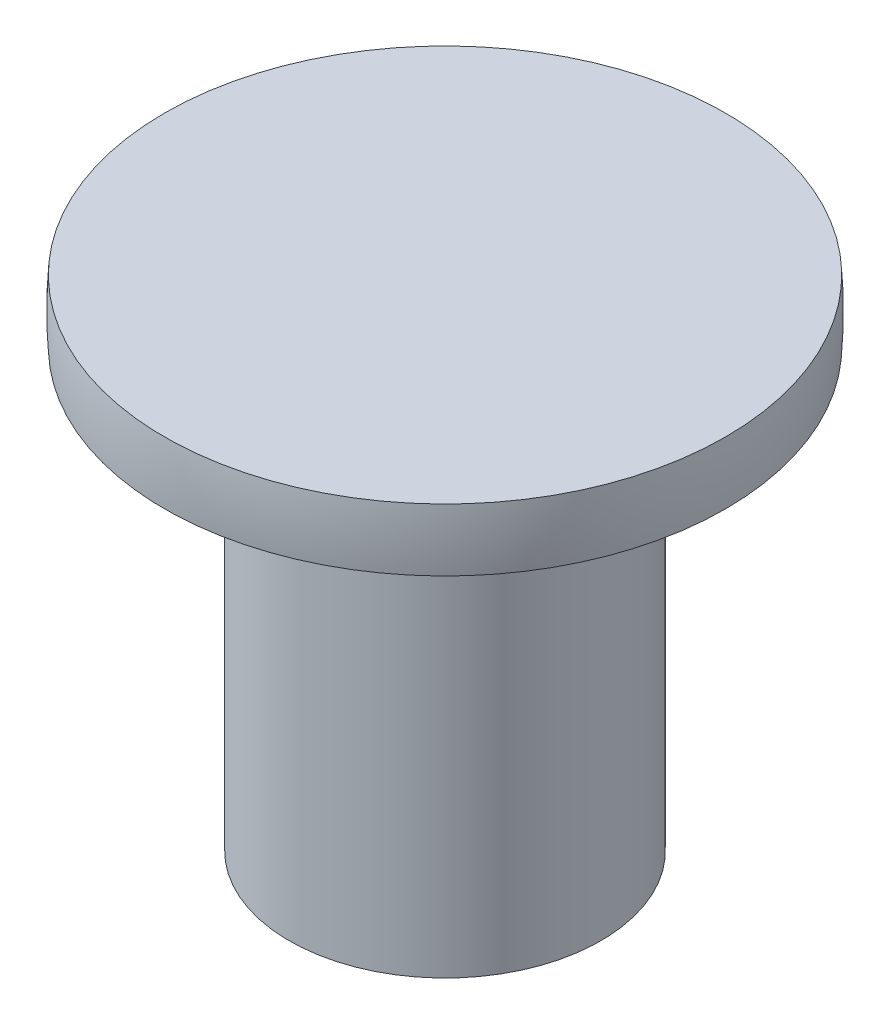
ISO-10303-21;
HEADER;
FILE_DESCRIPTION(('STEP AP214'),'2;1');
FILE_NAME('part.step','',(''),(''),'','','');
FILE_SCHEMA(('AUTOMOTIVE_DESIGN { 1 0 10303 214 1 1 1 1 }'));
ENDSEC;
DATA;
#1=APPLICATION_CONTEXT('core data for automotive mechanical design processes');
#2=APPLICATION_PROTOCOL_DEFINITION('international standard','automotive_design',2000,#1);
#3=PRODUCT_CONTEXT('',#1,'mechanical');
#4=PRODUCT('Part','Part','',(#3));
#5=PRODUCT_RELATED_PRODUCT_CATEGORY('part','',(#4));
#6=PRODUCT_DEFINITION_FORMATION('','',#4);
#7=PRODUCT_DEFINITION_CONTEXT('part definition',#1,'design');
#8=PRODUCT_DEFINITION('design','',#6,#7);
#9=PRODUCT_DEFINITION_SHAPE('','',#8);
#10=(LENGTH_UNIT() NAMED_UNIT(*) SI_UNIT(.MILLI.,.METRE.));
#11=(NAMED_UNIT(*) PLANE_ANGLE_UNIT() SI_UNIT($,.RADIAN.));
#12=(NAMED_UNIT(*) SI_UNIT($,.STERADIAN.) SOLID_ANGLE_UNIT());
#13=UNCERTAINTY_MEASURE_WITH_UNIT(LENGTH_MEASURE(1.E-05),#10,'distance_accuracy_value','');
#14=(GEOMETRIC_REPRESENTATION_CONTEXT(3) GLOBAL_UNCERTAINTY_ASSIGNED_CONTEXT((#13)) GLOBAL_UNIT_ASSIGNED_CONTEXT((#10,
#11,#12)) REPRESENTATION_CONTEXT('',''));
#15=CARTESIAN_POINT('',(0.,0.,0.));
#16=DIRECTION('',(0.,0.,1.));
#17=DIRECTION('',(1.,0.,0.));
#18=AXIS2_PLACEMENT_3D('',#15,#16,#17);
#19=CARTESIAN_POINT('',(4.5,8.,0.));
#20=DIRECTION('',(0.,-1.,0.));
#21=DIRECTION('',(1.,0.,0.));
#22=AXIS2_PLACEMENT_3D('',#19,#20,#21);
#23=PLANE('',#22);
#24=CARTESIAN_POINT('',(0.,8.,0.));
#25=DIRECTION('',(0.,1.,0.));
#26=DIRECTION('',(-1.,0.,0.));
#27=AXIS2_PLACEMENT_3D('',#24,#25,#26);
#28=CIRCLE('',#27,4.5);
#29=CARTESIAN_POINT('',(-4.5,8.,0.));
#30=VERTEX_POINT('',#29);
#31=EDGE_CURVE('E59',#30,#30,#28,.T.);
#32=ORIENTED_EDGE('',*,*,#31,.T.);
#33=EDGE_LOOP('',(#32));
#34=FACE_BOUND('',#33,.T.);
#35=ADVANCED_FACE('F37',(#34),#23,.F.);
#36=CARTESIAN_POINT('',(0.,4.5,0.));
#37=DIRECTION('',(0.,1.,0.));
#38=DIRECTION('',(-1.,0.,0.));
#39=AXIS2_PLACEMENT_3D('',#36,#37,#38);
#40=PLANE('',#39);
#41=CARTESIAN_POINT('',(0.,4.5,0.));
#42=DIRECTION('',(0.,1.,0.));
#43=DIRECTION('',(-1.,0.,0.));
#44=AXIS2_PLACEMENT_3D('',#41,#42,#43);
#45=CIRCLE('',#44,1.8);
#46=CARTESIAN_POINT('',(-1.8,4.5,0.));
#47=VERTEX_POINT('',#46);
#48=EDGE_CURVE('E10',#47,#47,#45,.T.);
#49=ORIENTED_EDGE('',*,*,#48,.F.);
#50=EDGE_LOOP('',(#49));
#51=FACE_BOUND('',#50,.T.);
#52=ADVANCED_FACE('F89',(#51),#40,.F.);
#53=CARTESIAN_POINT('',(0.,8.,0.));
#54=DIRECTION('',(0.,1.,0.));
#55=DIRECTION('',(-1.,0.,0.));
#56=AXIS2_PLACEMENT_3D('',#53,#54,#55);
#57=CYLINDRICAL_SURFACE('',#56,1.8);
#58=CARTESIAN_POINT('',(0.,0.,0.));
#59=DIRECTION('',(0.,1.,0.));
#60=DIRECTION('',(-1.,0.,0.));
#61=AXIS2_PLACEMENT_3D('',#58,#59,#60);
#62=CIRCLE('',#61,1.8);
#63=CARTESIAN_POINT('',(-1.8,0.,0.));
#64=VERTEX_POINT('',#63);
#65=EDGE_CURVE('E43',#64,#64,#62,.T.);
#66=ORIENTED_EDGE('',*,*,#65,.F.);
#67=EDGE_LOOP('',(#66));
#68=FACE_BOUND('',#67,.T.);
#69=ORIENTED_EDGE('',*,*,#48,.T.);
#70=EDGE_LOOP('',(#69));
#71=FACE_BOUND('',#70,.T.);
#72=ADVANCED_FACE('F84',(#68,#71),#57,.F.);
#73=CARTESIAN_POINT('',(1.8,0.,0.));
#74=DIRECTION('',(0.,1.,0.));
#75=DIRECTION('',(-1.,0.,0.));
#76=AXIS2_PLACEMENT_3D('',#73,#74,#75);
#77=PLANE('',#76);
#78=CARTESIAN_POINT('',(0.,0.,0.));
#79=DIRECTION('',(0.,1.,0.));
#80=DIRECTION('',(-1.,0.,0.));
#81=AXIS2_PLACEMENT_3D('',#78,#79,#80);
#82=CIRCLE('',#81,2.5);
#83=CARTESIAN_POINT('',(-2.5,0.,0.));
#84=VERTEX_POINT('',#83);
#85=EDGE_CURVE('E47',#84,#84,#82,.T.);
#86=ORIENTED_EDGE('',*,*,#85,.F.);
#87=EDGE_LOOP('',(#86));
#88=FACE_BOUND('',#87,.T.);
#89=ORIENTED_EDGE('',*,*,#65,.T.);
#90=EDGE_LOOP('',(#89));
#91=FACE_BOUND('',#90,.T.);
#92=ADVANCED_FACE('F79',(#88,#91),#77,.F.);
#93=CARTESIAN_POINT('',(0.,8.,0.));
#94=DIRECTION('',(0.,1.,0.));
#95=DIRECTION('',(-1.,0.,0.));
#96=AXIS2_PLACEMENT_3D('',#93,#94,#95);
#97=CYLINDRICAL_SURFACE('',#96,2.5);
#98=CARTESIAN_POINT('',(0.,7.,0.));
#99=DIRECTION('',(0.,1.,0.));
#100=DIRECTION('',(-1.,0.,0.));
#101=AXIS2_PLACEMENT_3D('',#98,#99,#100);
#102=CIRCLE('',#101,2.5);
#103=CARTESIAN_POINT('',(-2.5,7.,0.));
#104=VERTEX_POINT('',#103);
#105=EDGE_CURVE('E51',#104,#104,#102,.T.);
#106=ORIENTED_EDGE('',*,*,#105,.F.);
#107=EDGE_LOOP('',(#106));
#108=FACE_BOUND('',#107,.T.);
#109=ORIENTED_EDGE('',*,*,#85,.T.);
#110=EDGE_LOOP('',(#109));
#111=FACE_BOUND('',#110,.T.);
#112=ADVANCED_FACE('F73',(#108,#111),#97,.T.);
#113=CARTESIAN_POINT('',(2.5,7.,0.));
#114=DIRECTION('',(0.,1.,0.));
#115=DIRECTION('',(-1.,0.,0.));
#116=AXIS2_PLACEMENT_3D('',#113,#114,#115);
#117=PLANE('',#116);
#118=CARTESIAN_POINT('',(0.,7.,0.));
#119=DIRECTION('',(0.,1.,0.));
#120=DIRECTION('',(-1.,0.,0.));
#121=AXIS2_PLACEMENT_3D('',#118,#119,#120);
#122=CIRCLE('',#121,4.5);
#123=CARTESIAN_POINT('',(-4.5,7.,0.));
#124=VERTEX_POINT('',#123);
#125=EDGE_CURVE('E56',#124,#124,#122,.T.);
#126=ORIENTED_EDGE('',*,*,#125,.F.);
#127=EDGE_LOOP('',(#126));
#128=FACE_BOUND('',#127,.T.);
#129=ORIENTED_EDGE('',*,*,#105,.T.);
#130=EDGE_LOOP('',(#129));
#131=FACE_BOUND('',#130,.T.);
#132=ADVANCED_FACE('F67',(#128,#131),#117,.F.);
#133=CARTESIAN_POINT('',(0.,7.5,0.));
#134=DIRECTION('',(0.,1.,0.));
#135=DIRECTION('',(-1.,0.,0.));
#136=AXIS2_PLACEMENT_3D('',#133,#134,#135);
#137=DEGENERATE_TOROIDAL_SURFACE('',#136,1.98590860761674,6.50515260899826,.F.);
#138=ORIENTED_EDGE('',*,*,#31,.F.);
#139=EDGE_LOOP('',(#138));
#140=FACE_BOUND('',#139,.T.);
#141=ORIENTED_EDGE('',*,*,#125,.T.);
#142=EDGE_LOOP('',(#141));
#143=FACE_BOUND('',#142,.T.);
#144=ADVANCED_FACE('F64',(#140,#143),#137,.F.);
#145=CLOSED_SHELL('',(#35,#52,#72,#92,#112,#132,#144));
#146=MANIFOLD_SOLID_BREP('B2',#145);
#147=ADVANCED_BREP_SHAPE_REPRESENTATION('',(#18,#146),#14);
#148=SHAPE_DEFINITION_REPRESENTATION(#9,#147);
ENDSEC;
END-ISO-10303-21;
